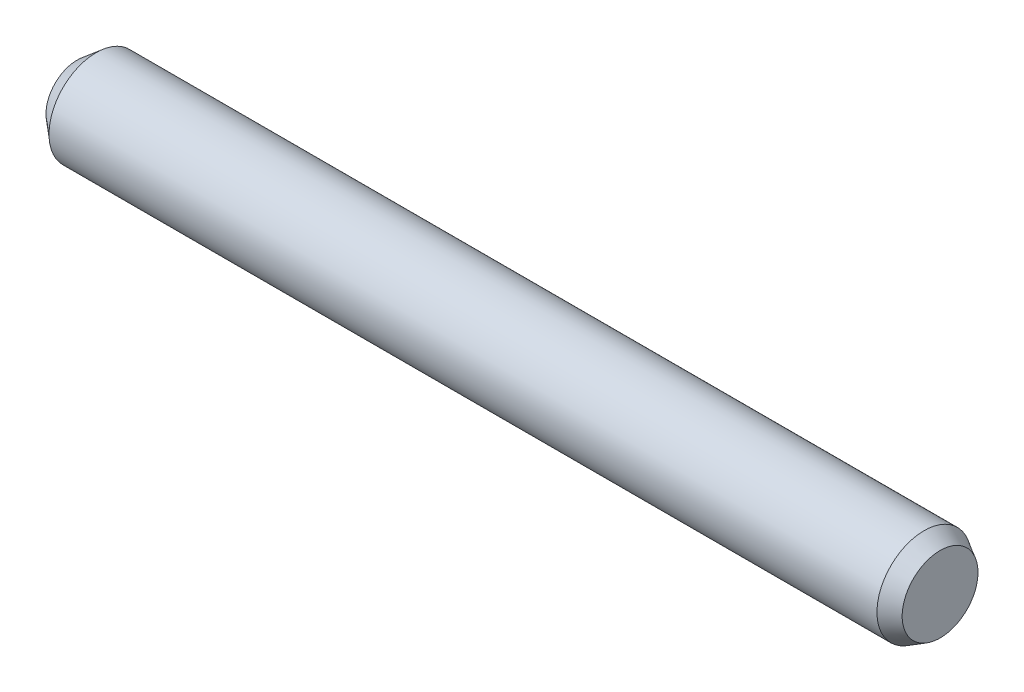
ISO-10303-21;
HEADER;
FILE_DESCRIPTION(('STEP AP214'),'2;1');
FILE_NAME('part.step','',(''),(''),'','','');
FILE_SCHEMA(('AUTOMOTIVE_DESIGN { 1 0 10303 214 1 1 1 1 }'));
ENDSEC;
DATA;
#1=APPLICATION_CONTEXT('core data for automotive mechanical design processes');
#2=APPLICATION_PROTOCOL_DEFINITION('international standard','automotive_design',2000,#1);
#3=PRODUCT_CONTEXT('',#1,'mechanical');
#4=PRODUCT('Part','Part','',(#3));
#5=PRODUCT_RELATED_PRODUCT_CATEGORY('part','',(#4));
#6=PRODUCT_DEFINITION_FORMATION('','',#4);
#7=PRODUCT_DEFINITION_CONTEXT('part definition',#1,'design');
#8=PRODUCT_DEFINITION('design','',#6,#7);
#9=PRODUCT_DEFINITION_SHAPE('','',#8);
#10=(LENGTH_UNIT() NAMED_UNIT(*) SI_UNIT(.MILLI.,.METRE.));
#11=(NAMED_UNIT(*) PLANE_ANGLE_UNIT() SI_UNIT($,.RADIAN.));
#12=(NAMED_UNIT(*) SI_UNIT($,.STERADIAN.) SOLID_ANGLE_UNIT());
#13=UNCERTAINTY_MEASURE_WITH_UNIT(LENGTH_MEASURE(1.E-05),#10,'distance_accuracy_value','');
#14=(GEOMETRIC_REPRESENTATION_CONTEXT(3) GLOBAL_UNCERTAINTY_ASSIGNED_CONTEXT((#13)) GLOBAL_UNIT_ASSIGNED_CONTEXT((#10,
#11,#12)) REPRESENTATION_CONTEXT('',''));
#15=CARTESIAN_POINT('',(0.,0.,0.));
#16=DIRECTION('',(0.,0.,1.));
#17=DIRECTION('',(1.,0.,0.));
#18=AXIS2_PLACEMENT_3D('',#15,#16,#17);
#19=CARTESIAN_POINT('',(27.,0.,0.));
#20=DIRECTION('',(-1.,0.,0.));
#21=DIRECTION('',(0.,0.,1.));
#22=AXIS2_PLACEMENT_3D('',#19,#20,#21);
#23=CYLINDRICAL_SURFACE('',#22,1.475);
#24=CARTESIAN_POINT('',(0.595876796297114,0.,0.));
#25=DIRECTION('',(1.,0.,0.));
#26=DIRECTION('',(0.,0.,-1.));
#27=AXIS2_PLACEMENT_3D('',#24,#25,#26);
#28=CIRCLE('',#27,1.475);
#29=CARTESIAN_POINT('',(0.595876796297114,0.,-1.475));
#30=VERTEX_POINT('',#29);
#31=EDGE_CURVE('E40',#30,#30,#28,.T.);
#32=ORIENTED_EDGE('',*,*,#31,.T.);
#33=EDGE_LOOP('',(#32));
#34=FACE_BOUND('',#33,.T.);
#35=CARTESIAN_POINT('',(26.5,0.,0.));
#36=DIRECTION('',(1.,0.,0.));
#37=DIRECTION('',(0.,0.,-1.));
#38=AXIS2_PLACEMENT_3D('',#35,#36,#37);
#39=CIRCLE('',#38,1.475);
#40=CARTESIAN_POINT('',(26.5,0.,-1.475));
#41=VERTEX_POINT('',#40);
#42=EDGE_CURVE('E44',#41,#41,#39,.F.);
#43=ORIENTED_EDGE('',*,*,#42,.T.);
#44=EDGE_LOOP('',(#43));
#45=FACE_BOUND('',#44,.T.);
#46=ADVANCED_FACE('F33',(#34,#45),#23,.T.);
#47=CARTESIAN_POINT('',(27.,0.,0.));
#48=DIRECTION('',(1.,0.,0.));
#49=DIRECTION('',(0.,0.,-1.));
#50=AXIS2_PLACEMENT_3D('',#47,#48,#49);
#51=PLANE('',#50);
#52=CARTESIAN_POINT('',(27.,0.,0.));
#53=DIRECTION('',(1.,0.,0.));
#54=DIRECTION('',(0.,0.,-1.));
#55=AXIS2_PLACEMENT_3D('',#52,#53,#54);
#56=CIRCLE('',#55,1.18632486540519);
#57=CARTESIAN_POINT('',(27.,0.,-1.18632486540519));
#58=VERTEX_POINT('',#57);
#59=EDGE_CURVE('E48',#58,#58,#56,.T.);
#60=ORIENTED_EDGE('',*,*,#59,.T.);
#61=EDGE_LOOP('',(#60));
#62=FACE_BOUND('',#61,.T.);
#63=ADVANCED_FACE('F54',(#62),#51,.T.);
#64=CARTESIAN_POINT('',(0.,0.,0.));
#65=DIRECTION('',(1.,0.,0.));
#66=DIRECTION('',(0.,0.,-1.));
#67=AXIS2_PLACEMENT_3D('',#64,#65,#66);
#68=PLANE('',#67);
#69=CARTESIAN_POINT('',(0.,0.,0.));
#70=DIRECTION('',(1.,0.,0.));
#71=DIRECTION('',(0.,0.,-1.));
#72=AXIS2_PLACEMENT_3D('',#69,#70,#71);
#73=CIRCLE('',#72,0.974999999999997);
#74=CARTESIAN_POINT('',(0.,0.,-0.974999999999997));
#75=VERTEX_POINT('',#74);
#76=EDGE_CURVE('E10',#75,#75,#73,.F.);
#77=ORIENTED_EDGE('',*,*,#76,.T.);
#78=EDGE_LOOP('',(#77));
#79=FACE_BOUND('',#78,.T.);
#80=ADVANCED_FACE('F58',(#79),#68,.F.);
#81=CARTESIAN_POINT('',(27.,0.,0.));
#82=DIRECTION('',(-1.,0.,0.));
#83=DIRECTION('',(0.,0.,1.));
#84=AXIS2_PLACEMENT_3D('',#81,#82,#83);
#85=CONICAL_SURFACE('',#84,1.18632486540519,0.523598775598299);
#86=ORIENTED_EDGE('',*,*,#42,.F.);
#87=EDGE_LOOP('',(#86));
#88=FACE_BOUND('',#87,.T.);
#89=ORIENTED_EDGE('',*,*,#59,.F.);
#90=EDGE_LOOP('',(#89));
#91=FACE_BOUND('',#90,.T.);
#92=ADVANCED_FACE('F56',(#88,#91),#85,.T.);
#93=CARTESIAN_POINT('',(0.595876796297114,0.,0.));
#94=DIRECTION('',(1.,0.,0.));
#95=DIRECTION('',(0.,0.,-1.));
#96=AXIS2_PLACEMENT_3D('',#93,#94,#95);
#97=CONICAL_SURFACE('',#96,1.475,0.698131700797729);
#98=ORIENTED_EDGE('',*,*,#76,.F.);
#99=EDGE_LOOP('',(#98));
#100=FACE_BOUND('',#99,.T.);
#101=ORIENTED_EDGE('',*,*,#31,.F.);
#102=EDGE_LOOP('',(#101));
#103=FACE_BOUND('',#102,.T.);
#104=ADVANCED_FACE('F35',(#100,#103),#97,.T.);
#105=CLOSED_SHELL('',(#46,#63,#80,#92,#104));
#106=MANIFOLD_SOLID_BREP('B2',#105);
#107=ADVANCED_BREP_SHAPE_REPRESENTATION('',(#18,#106),#14);
#108=SHAPE_DEFINITION_REPRESENTATION(#9,#107);
ENDSEC;
END-ISO-10303-21;
